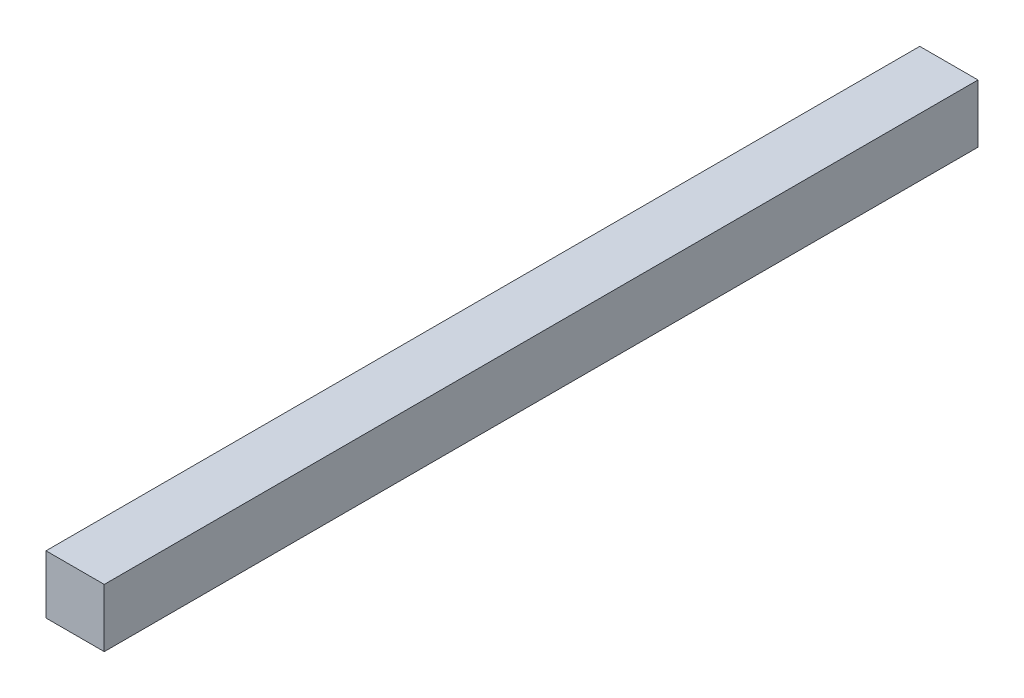
ISO-10303-21;
HEADER;
FILE_DESCRIPTION(('STEP AP214'),'2;1');
FILE_NAME('part.step','',(''),(''),'','','');
FILE_SCHEMA(('AUTOMOTIVE_DESIGN { 1 0 10303 214 1 1 1 1 }'));
ENDSEC;
DATA;
#1=APPLICATION_CONTEXT('core data for automotive mechanical design processes');
#2=APPLICATION_PROTOCOL_DEFINITION('international standard','automotive_design',2000,#1);
#3=PRODUCT_CONTEXT('',#1,'mechanical');
#4=PRODUCT('Part','Part','',(#3));
#5=PRODUCT_RELATED_PRODUCT_CATEGORY('part','',(#4));
#6=PRODUCT_DEFINITION_FORMATION('','',#4);
#7=PRODUCT_DEFINITION_CONTEXT('part definition',#1,'design');
#8=PRODUCT_DEFINITION('design','',#6,#7);
#9=PRODUCT_DEFINITION_SHAPE('','',#8);
#10=(LENGTH_UNIT() NAMED_UNIT(*) SI_UNIT(.MILLI.,.METRE.));
#11=(NAMED_UNIT(*) PLANE_ANGLE_UNIT() SI_UNIT($,.RADIAN.));
#12=(NAMED_UNIT(*) SI_UNIT($,.STERADIAN.) SOLID_ANGLE_UNIT());
#13=UNCERTAINTY_MEASURE_WITH_UNIT(LENGTH_MEASURE(1.E-05),#10,'distance_accuracy_value','');
#14=(GEOMETRIC_REPRESENTATION_CONTEXT(3) GLOBAL_UNCERTAINTY_ASSIGNED_CONTEXT((#13)) GLOBAL_UNIT_ASSIGNED_CONTEXT((#10,
#11,#12)) REPRESENTATION_CONTEXT('',''));
#15=CARTESIAN_POINT('',(0.,0.,0.));
#16=DIRECTION('',(0.,0.,1.));
#17=DIRECTION('',(1.,0.,0.));
#18=AXIS2_PLACEMENT_3D('',#15,#16,#17);
#19=CARTESIAN_POINT('',(0.,0.,1500.));
#20=DIRECTION('',(1.,0.,0.));
#21=DIRECTION('',(0.,0.,-1.));
#22=AXIS2_PLACEMENT_3D('',#19,#20,#21);
#23=PLANE('',#22);
#24=DIRECTION('',(0.,-1.,0.));
#25=VECTOR('',#24,1.);
#26=CARTESIAN_POINT('',(0.,0.,0.));
#27=LINE('',#26,#25);
#28=CARTESIAN_POINT('',(0.,100.,0.));
#29=VERTEX_POINT('',#28);
#30=CARTESIAN_POINT('',(0.,0.,0.));
#31=VERTEX_POINT('',#30);
#32=EDGE_CURVE('E100',#29,#31,#27,.T.);
#33=ORIENTED_EDGE('',*,*,#32,.T.);
#34=DIRECTION('',(0.,0.,-1.));
#35=VECTOR('',#34,1.);
#36=CARTESIAN_POINT('',(0.,0.,1500.));
#37=LINE('',#36,#35);
#38=CARTESIAN_POINT('',(0.,0.,1500.));
#39=VERTEX_POINT('',#38);
#40=EDGE_CURVE('E11',#39,#31,#37,.T.);
#41=ORIENTED_EDGE('',*,*,#40,.F.);
#42=DIRECTION('',(0.,-1.,0.));
#43=VECTOR('',#42,1.);
#44=CARTESIAN_POINT('',(0.,0.,1500.));
#45=LINE('',#44,#43);
#46=CARTESIAN_POINT('',(0.,100.,1500.));
#47=VERTEX_POINT('',#46);
#48=EDGE_CURVE('E88',#47,#39,#45,.T.);
#49=ORIENTED_EDGE('',*,*,#48,.F.);
#50=DIRECTION('',(0.,0.,-1.));
#51=VECTOR('',#50,1.);
#52=CARTESIAN_POINT('',(0.,100.,1500.));
#53=LINE('',#52,#51);
#54=EDGE_CURVE('E96',#47,#29,#53,.T.);
#55=ORIENTED_EDGE('',*,*,#54,.T.);
#56=EDGE_LOOP('',(#33,#41,#49,#55));
#57=FACE_BOUND('',#56,.T.);
#58=ADVANCED_FACE('F37',(#57),#23,.F.);
#59=CARTESIAN_POINT('',(0.,0.,1500.));
#60=DIRECTION('',(0.,1.,0.));
#61=DIRECTION('',(0.,0.,1.));
#62=AXIS2_PLACEMENT_3D('',#59,#60,#61);
#63=PLANE('',#62);
#64=DIRECTION('',(1.,0.,0.));
#65=VECTOR('',#64,1.);
#66=CARTESIAN_POINT('',(0.,0.,0.));
#67=LINE('',#66,#65);
#68=CARTESIAN_POINT('',(100.,0.,0.));
#69=VERTEX_POINT('',#68);
#70=EDGE_CURVE('E92',#31,#69,#67,.T.);
#71=ORIENTED_EDGE('',*,*,#70,.T.);
#72=DIRECTION('',(0.,0.,-1.));
#73=VECTOR('',#72,1.);
#74=CARTESIAN_POINT('',(100.,0.,1500.));
#75=LINE('',#74,#73);
#76=CARTESIAN_POINT('',(100.,0.,1500.));
#77=VERTEX_POINT('',#76);
#78=EDGE_CURVE('E45',#77,#69,#75,.T.);
#79=ORIENTED_EDGE('',*,*,#78,.F.);
#80=DIRECTION('',(1.,0.,0.));
#81=VECTOR('',#80,1.);
#82=CARTESIAN_POINT('',(0.,0.,1500.));
#83=LINE('',#82,#81);
#84=EDGE_CURVE('E83',#39,#77,#83,.T.);
#85=ORIENTED_EDGE('',*,*,#84,.F.);
#86=ORIENTED_EDGE('',*,*,#40,.T.);
#87=EDGE_LOOP('',(#71,#79,#85,#86));
#88=FACE_BOUND('',#87,.T.);
#89=ADVANCED_FACE('F91',(#88),#63,.F.);
#90=CARTESIAN_POINT('',(100.,0.,1500.));
#91=DIRECTION('',(-1.,0.,0.));
#92=DIRECTION('',(0.,0.,1.));
#93=AXIS2_PLACEMENT_3D('',#90,#91,#92);
#94=PLANE('',#93);
#95=DIRECTION('',(0.,1.,0.));
#96=VECTOR('',#95,1.);
#97=CARTESIAN_POINT('',(100.,0.,0.));
#98=LINE('',#97,#96);
#99=CARTESIAN_POINT('',(100.,100.,0.));
#100=VERTEX_POINT('',#99);
#101=EDGE_CURVE('E70',#69,#100,#98,.T.);
#102=ORIENTED_EDGE('',*,*,#101,.T.);
#103=DIRECTION('',(0.,0.,-1.));
#104=VECTOR('',#103,1.);
#105=CARTESIAN_POINT('',(100.,100.,1500.));
#106=LINE('',#105,#104);
#107=CARTESIAN_POINT('',(100.,100.,1500.));
#108=VERTEX_POINT('',#107);
#109=EDGE_CURVE('E93',#108,#100,#106,.T.);
#110=ORIENTED_EDGE('',*,*,#109,.F.);
#111=DIRECTION('',(0.,1.,0.));
#112=VECTOR('',#111,1.);
#113=CARTESIAN_POINT('',(100.,0.,1500.));
#114=LINE('',#113,#112);
#115=EDGE_CURVE('E86',#77,#108,#114,.T.);
#116=ORIENTED_EDGE('',*,*,#115,.F.);
#117=ORIENTED_EDGE('',*,*,#78,.T.);
#118=EDGE_LOOP('',(#102,#110,#116,#117));
#119=FACE_BOUND('',#118,.T.);
#120=ADVANCED_FACE('F94',(#119),#94,.F.);
#121=CARTESIAN_POINT('',(0.,100.,1500.));
#122=DIRECTION('',(0.,-1.,0.));
#123=DIRECTION('',(0.,0.,-1.));
#124=AXIS2_PLACEMENT_3D('',#121,#122,#123);
#125=PLANE('',#124);
#126=DIRECTION('',(-1.,0.,0.));
#127=VECTOR('',#126,1.);
#128=CARTESIAN_POINT('',(0.,100.,0.));
#129=LINE('',#128,#127);
#130=EDGE_CURVE('E76',#100,#29,#129,.T.);
#131=ORIENTED_EDGE('',*,*,#130,.T.);
#132=ORIENTED_EDGE('',*,*,#54,.F.);
#133=DIRECTION('',(-1.,0.,0.));
#134=VECTOR('',#133,1.);
#135=CARTESIAN_POINT('',(0.,100.,1500.));
#136=LINE('',#135,#134);
#137=EDGE_CURVE('E53',#108,#47,#136,.T.);
#138=ORIENTED_EDGE('',*,*,#137,.F.);
#139=ORIENTED_EDGE('',*,*,#109,.T.);
#140=EDGE_LOOP('',(#131,#132,#138,#139));
#141=FACE_BOUND('',#140,.T.);
#142=ADVANCED_FACE('F107',(#141),#125,.F.);
#143=CARTESIAN_POINT('',(0.,100.,1500.));
#144=DIRECTION('',(0.,0.,-1.));
#145=DIRECTION('',(-1.,0.,0.));
#146=AXIS2_PLACEMENT_3D('',#143,#144,#145);
#147=PLANE('',#146);
#148=ORIENTED_EDGE('',*,*,#48,.T.);
#149=ORIENTED_EDGE('',*,*,#84,.T.);
#150=ORIENTED_EDGE('',*,*,#115,.T.);
#151=ORIENTED_EDGE('',*,*,#137,.T.);
#152=EDGE_LOOP('',(#148,#149,#150,#151));
#153=FACE_BOUND('',#152,.T.);
#154=ADVANCED_FACE('F84',(#153),#147,.F.);
#155=CARTESIAN_POINT('',(0.,100.,0.));
#156=DIRECTION('',(0.,0.,-1.));
#157=DIRECTION('',(-1.,0.,0.));
#158=AXIS2_PLACEMENT_3D('',#155,#156,#157);
#159=PLANE('',#158);
#160=ORIENTED_EDGE('',*,*,#32,.F.);
#161=ORIENTED_EDGE('',*,*,#130,.F.);
#162=ORIENTED_EDGE('',*,*,#101,.F.);
#163=ORIENTED_EDGE('',*,*,#70,.F.);
#164=EDGE_LOOP('',(#160,#161,#162,#163));
#165=FACE_BOUND('',#164,.T.);
#166=ADVANCED_FACE('F110',(#165),#159,.T.);
#167=CLOSED_SHELL('',(#58,#89,#120,#142,#154,#166));
#168=MANIFOLD_SOLID_BREP('B2',#167);
#169=ADVANCED_BREP_SHAPE_REPRESENTATION('',(#18,#168),#14);
#170=SHAPE_DEFINITION_REPRESENTATION(#9,#169);
ENDSEC;
END-ISO-10303-21;
